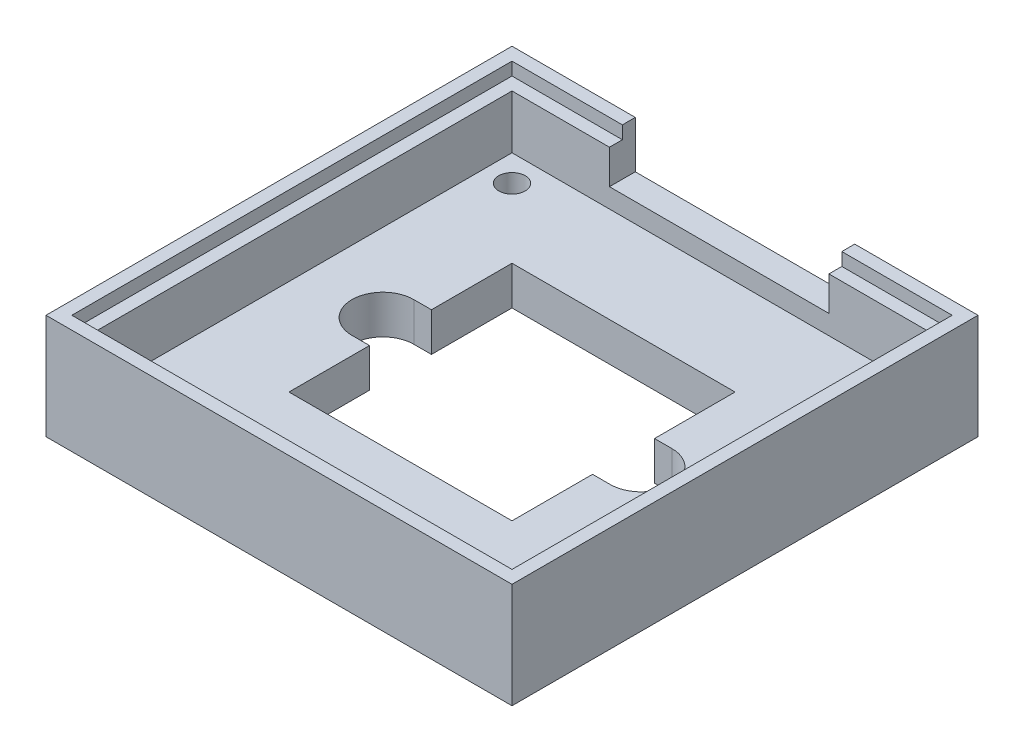
ISO-10303-21;
HEADER;
FILE_DESCRIPTION(('STEP AP214'),'2;1');
FILE_NAME('part.step','',(''),(''),'','','');
FILE_SCHEMA(('AUTOMOTIVE_DESIGN { 1 0 10303 214 1 1 1 1 }'));
ENDSEC;
DATA;
#1=APPLICATION_CONTEXT('core data for automotive mechanical design processes');
#2=APPLICATION_PROTOCOL_DEFINITION('international standard','automotive_design',2000,#1);
#3=PRODUCT_CONTEXT('',#1,'mechanical');
#4=PRODUCT('Part','Part','',(#3));
#5=PRODUCT_RELATED_PRODUCT_CATEGORY('part','',(#4));
#6=PRODUCT_DEFINITION_FORMATION('','',#4);
#7=PRODUCT_DEFINITION_CONTEXT('part definition',#1,'design');
#8=PRODUCT_DEFINITION('design','',#6,#7);
#9=PRODUCT_DEFINITION_SHAPE('','',#8);
#10=(LENGTH_UNIT() NAMED_UNIT(*) SI_UNIT(.MILLI.,.METRE.));
#11=(NAMED_UNIT(*) PLANE_ANGLE_UNIT() SI_UNIT($,.RADIAN.));
#12=(NAMED_UNIT(*) SI_UNIT($,.STERADIAN.) SOLID_ANGLE_UNIT());
#13=UNCERTAINTY_MEASURE_WITH_UNIT(LENGTH_MEASURE(1.E-05),#10,'distance_accuracy_value','');
#14=(GEOMETRIC_REPRESENTATION_CONTEXT(3) GLOBAL_UNCERTAINTY_ASSIGNED_CONTEXT((#13)) GLOBAL_UNIT_ASSIGNED_CONTEXT((#10,
#11,#12)) REPRESENTATION_CONTEXT('',''));
#15=CARTESIAN_POINT('',(0.,0.,0.));
#16=DIRECTION('',(0.,0.,1.));
#17=DIRECTION('',(1.,0.,0.));
#18=AXIS2_PLACEMENT_3D('',#15,#16,#17);
#19=CARTESIAN_POINT('',(-10.,3.,0.));
#20=DIRECTION('',(0.,-1.,0.));
#21=DIRECTION('',(0.,0.,-1.));
#22=AXIS2_PLACEMENT_3D('',#19,#20,#21);
#23=CYLINDRICAL_SURFACE('',#22,2.4);
#24=CARTESIAN_POINT('',(-10.,0.,0.));
#25=DIRECTION('',(0.,1.,0.));
#26=DIRECTION('',(0.,0.,1.));
#27=AXIS2_PLACEMENT_3D('',#24,#25,#26);
#28=CIRCLE('',#27,2.4);
#29=CARTESIAN_POINT('',(-10.,0.,-2.4));
#30=VERTEX_POINT('',#29);
#31=CARTESIAN_POINT('',(-10.,0.,2.4));
#32=VERTEX_POINT('',#31);
#33=EDGE_CURVE('E346',#30,#32,#28,.T.);
#34=ORIENTED_EDGE('',*,*,#33,.F.);
#35=DIRECTION('',(0.,-1.,0.));
#36=VECTOR('',#35,1.);
#37=CARTESIAN_POINT('',(-10.,3.,-2.4));
#38=LINE('',#37,#36);
#39=CARTESIAN_POINT('',(-10.,3.,-2.4));
#40=VERTEX_POINT('',#39);
#41=EDGE_CURVE('E419',#40,#30,#38,.T.);
#42=ORIENTED_EDGE('',*,*,#41,.F.);
#43=CARTESIAN_POINT('',(-10.,3.,0.));
#44=DIRECTION('',(0.,1.,0.));
#45=DIRECTION('',(0.,0.,1.));
#46=AXIS2_PLACEMENT_3D('',#43,#44,#45);
#47=CIRCLE('',#46,2.4);
#48=CARTESIAN_POINT('',(-10.,3.,2.4));
#49=VERTEX_POINT('',#48);
#50=EDGE_CURVE('E289',#40,#49,#47,.T.);
#51=ORIENTED_EDGE('',*,*,#50,.T.);
#52=DIRECTION('',(0.,-1.,0.));
#53=VECTOR('',#52,1.);
#54=CARTESIAN_POINT('',(-10.,3.,2.4));
#55=LINE('',#54,#53);
#56=EDGE_CURVE('E393',#49,#32,#55,.T.);
#57=ORIENTED_EDGE('',*,*,#56,.T.);
#58=EDGE_LOOP('',(#34,#42,#51,#57));
#59=FACE_BOUND('',#58,.T.);
#60=ADVANCED_FACE('F49',(#59),#23,.F.);
#61=CARTESIAN_POINT('',(0.,3.,-2.4));
#62=DIRECTION('',(0.,0.,-1.));
#63=DIRECTION('',(-1.,0.,0.));
#64=AXIS2_PLACEMENT_3D('',#61,#62,#63);
#65=PLANE('',#64);
#66=DIRECTION('',(1.,0.,0.));
#67=VECTOR('',#66,1.);
#68=CARTESIAN_POINT('',(0.,0.,-2.4));
#69=LINE('',#68,#67);
#70=CARTESIAN_POINT('',(-8.64,0.,-2.4));
#71=VERTEX_POINT('',#70);
#72=EDGE_CURVE('E349',#30,#71,#69,.T.);
#73=ORIENTED_EDGE('',*,*,#72,.T.);
#74=DIRECTION('',(0.,-1.,0.));
#75=VECTOR('',#74,1.);
#76=CARTESIAN_POINT('',(-8.64,3.,-2.4));
#77=LINE('',#76,#75);
#78=CARTESIAN_POINT('',(-8.64,3.,-2.4));
#79=VERTEX_POINT('',#78);
#80=EDGE_CURVE('E416',#79,#71,#77,.T.);
#81=ORIENTED_EDGE('',*,*,#80,.F.);
#82=DIRECTION('',(1.,0.,0.));
#83=VECTOR('',#82,1.);
#84=CARTESIAN_POINT('',(0.,3.,-2.4));
#85=LINE('',#84,#83);
#86=EDGE_CURVE('E292',#40,#79,#85,.T.);
#87=ORIENTED_EDGE('',*,*,#86,.F.);
#88=ORIENTED_EDGE('',*,*,#41,.T.);
#89=EDGE_LOOP('',(#73,#81,#87,#88));
#90=FACE_BOUND('',#89,.T.);
#91=ADVANCED_FACE('F576',(#90),#65,.F.);
#92=CARTESIAN_POINT('',(-8.64,3.,0.));
#93=DIRECTION('',(-1.,0.,0.));
#94=DIRECTION('',(0.,0.,1.));
#95=AXIS2_PLACEMENT_3D('',#92,#93,#94);
#96=PLANE('',#95);
#97=DIRECTION('',(0.,0.,-1.));
#98=VECTOR('',#97,1.);
#99=CARTESIAN_POINT('',(-8.64,0.,0.));
#100=LINE('',#99,#98);
#101=CARTESIAN_POINT('',(-8.64,0.,-8.64));
#102=VERTEX_POINT('',#101);
#103=EDGE_CURVE('E352',#71,#102,#100,.T.);
#104=ORIENTED_EDGE('',*,*,#103,.T.);
#105=DIRECTION('',(0.,-1.,0.));
#106=VECTOR('',#105,1.);
#107=CARTESIAN_POINT('',(-8.64,3.,-8.64));
#108=LINE('',#107,#106);
#109=CARTESIAN_POINT('',(-8.64,3.,-8.64));
#110=VERTEX_POINT('',#109);
#111=EDGE_CURVE('E413',#110,#102,#108,.T.);
#112=ORIENTED_EDGE('',*,*,#111,.F.);
#113=DIRECTION('',(0.,0.,-1.));
#114=VECTOR('',#113,1.);
#115=CARTESIAN_POINT('',(-8.64,3.,0.));
#116=LINE('',#115,#114);
#117=EDGE_CURVE('E296',#79,#110,#116,.T.);
#118=ORIENTED_EDGE('',*,*,#117,.F.);
#119=ORIENTED_EDGE('',*,*,#80,.T.);
#120=EDGE_LOOP('',(#104,#112,#118,#119));
#121=FACE_BOUND('',#120,.T.);
#122=ADVANCED_FACE('F582',(#121),#96,.F.);
#123=CARTESIAN_POINT('',(0.,3.,-8.64));
#124=DIRECTION('',(0.,0.,-1.));
#125=DIRECTION('',(-1.,0.,0.));
#126=AXIS2_PLACEMENT_3D('',#123,#124,#125);
#127=PLANE('',#126);
#128=DIRECTION('',(1.,0.,0.));
#129=VECTOR('',#128,1.);
#130=CARTESIAN_POINT('',(0.,0.,-8.64));
#131=LINE('',#130,#129);
#132=CARTESIAN_POINT('',(8.64,0.,-8.64));
#133=VERTEX_POINT('',#132);
#134=EDGE_CURVE('E355',#102,#133,#131,.T.);
#135=ORIENTED_EDGE('',*,*,#134,.T.);
#136=DIRECTION('',(0.,-1.,0.));
#137=VECTOR('',#136,1.);
#138=CARTESIAN_POINT('',(8.64,3.,-8.64));
#139=LINE('',#138,#137);
#140=CARTESIAN_POINT('',(8.64,3.,-8.64));
#141=VERTEX_POINT('',#140);
#142=EDGE_CURVE('E411',#141,#133,#139,.T.);
#143=ORIENTED_EDGE('',*,*,#142,.F.);
#144=DIRECTION('',(1.,0.,0.));
#145=VECTOR('',#144,1.);
#146=CARTESIAN_POINT('',(0.,3.,-8.64));
#147=LINE('',#146,#145);
#148=EDGE_CURVE('E299',#110,#141,#147,.T.);
#149=ORIENTED_EDGE('',*,*,#148,.F.);
#150=ORIENTED_EDGE('',*,*,#111,.T.);
#151=EDGE_LOOP('',(#135,#143,#149,#150));
#152=FACE_BOUND('',#151,.T.);
#153=ADVANCED_FACE('F631',(#152),#127,.F.);
#154=CARTESIAN_POINT('',(8.64,3.,0.));
#155=DIRECTION('',(-1.,0.,0.));
#156=DIRECTION('',(0.,0.,1.));
#157=AXIS2_PLACEMENT_3D('',#154,#155,#156);
#158=PLANE('',#157);
#159=DIRECTION('',(0.,0.,-1.));
#160=VECTOR('',#159,1.);
#161=CARTESIAN_POINT('',(8.64,0.,0.));
#162=LINE('',#161,#160);
#163=CARTESIAN_POINT('',(8.64,0.,-2.4));
#164=VERTEX_POINT('',#163);
#165=EDGE_CURVE('E358',#164,#133,#162,.T.);
#166=ORIENTED_EDGE('',*,*,#165,.F.);
#167=DIRECTION('',(0.,-1.,0.));
#168=VECTOR('',#167,1.);
#169=CARTESIAN_POINT('',(8.64,3.,-2.4));
#170=LINE('',#169,#168);
#171=CARTESIAN_POINT('',(8.64,3.,-2.4));
#172=VERTEX_POINT('',#171);
#173=EDGE_CURVE('E409',#172,#164,#170,.T.);
#174=ORIENTED_EDGE('',*,*,#173,.F.);
#175=DIRECTION('',(0.,0.,-1.));
#176=VECTOR('',#175,1.);
#177=CARTESIAN_POINT('',(8.64,3.,0.));
#178=LINE('',#177,#176);
#179=EDGE_CURVE('E301',#172,#141,#178,.T.);
#180=ORIENTED_EDGE('',*,*,#179,.T.);
#181=ORIENTED_EDGE('',*,*,#142,.T.);
#182=EDGE_LOOP('',(#166,#174,#180,#181));
#183=FACE_BOUND('',#182,.T.);
#184=ADVANCED_FACE('F627',(#183),#158,.T.);
#185=CARTESIAN_POINT('',(0.,3.,-2.4));
#186=DIRECTION('',(0.,0.,1.));
#187=DIRECTION('',(1.,0.,0.));
#188=AXIS2_PLACEMENT_3D('',#185,#186,#187);
#189=PLANE('',#188);
#190=DIRECTION('',(-1.,0.,0.));
#191=VECTOR('',#190,1.);
#192=CARTESIAN_POINT('',(0.,0.,-2.4));
#193=LINE('',#192,#191);
#194=CARTESIAN_POINT('',(10.,0.,-2.4));
#195=VERTEX_POINT('',#194);
#196=EDGE_CURVE('E361',#195,#164,#193,.T.);
#197=ORIENTED_EDGE('',*,*,#196,.F.);
#198=DIRECTION('',(0.,-1.,0.));
#199=VECTOR('',#198,1.);
#200=CARTESIAN_POINT('',(10.,3.,-2.4));
#201=LINE('',#200,#199);
#202=CARTESIAN_POINT('',(10.,3.,-2.4));
#203=VERTEX_POINT('',#202);
#204=EDGE_CURVE('E407',#203,#195,#201,.T.);
#205=ORIENTED_EDGE('',*,*,#204,.F.);
#206=DIRECTION('',(-1.,0.,0.));
#207=VECTOR('',#206,1.);
#208=CARTESIAN_POINT('',(0.,3.,-2.4));
#209=LINE('',#208,#207);
#210=EDGE_CURVE('E304',#203,#172,#209,.T.);
#211=ORIENTED_EDGE('',*,*,#210,.T.);
#212=ORIENTED_EDGE('',*,*,#173,.T.);
#213=EDGE_LOOP('',(#197,#205,#211,#212));
#214=FACE_BOUND('',#213,.T.);
#215=ADVANCED_FACE('F623',(#214),#189,.T.);
#216=CARTESIAN_POINT('',(10.,3.,0.));
#217=DIRECTION('',(0.,-1.,0.));
#218=DIRECTION('',(0.,0.,-1.));
#219=AXIS2_PLACEMENT_3D('',#216,#217,#218);
#220=CYLINDRICAL_SURFACE('',#219,2.4);
#221=CARTESIAN_POINT('',(10.,0.,0.));
#222=DIRECTION('',(0.,1.,0.));
#223=DIRECTION('',(0.,0.,1.));
#224=AXIS2_PLACEMENT_3D('',#221,#222,#223);
#225=CIRCLE('',#224,2.4);
#226=CARTESIAN_POINT('',(10.,0.,2.4));
#227=VERTEX_POINT('',#226);
#228=EDGE_CURVE('E364',#195,#227,#225,.F.);
#229=ORIENTED_EDGE('',*,*,#228,.T.);
#230=DIRECTION('',(0.,-1.,0.));
#231=VECTOR('',#230,1.);
#232=CARTESIAN_POINT('',(10.,3.,2.4));
#233=LINE('',#232,#231);
#234=CARTESIAN_POINT('',(10.,3.,2.4));
#235=VERTEX_POINT('',#234);
#236=EDGE_CURVE('E404',#235,#227,#233,.T.);
#237=ORIENTED_EDGE('',*,*,#236,.F.);
#238=CARTESIAN_POINT('',(10.,3.,0.));
#239=DIRECTION('',(0.,1.,0.));
#240=DIRECTION('',(0.,0.,1.));
#241=AXIS2_PLACEMENT_3D('',#238,#239,#240);
#242=CIRCLE('',#241,2.4);
#243=EDGE_CURVE('E307',#203,#235,#242,.F.);
#244=ORIENTED_EDGE('',*,*,#243,.F.);
#245=ORIENTED_EDGE('',*,*,#204,.T.);
#246=EDGE_LOOP('',(#229,#237,#244,#245));
#247=FACE_BOUND('',#246,.T.);
#248=ADVANCED_FACE('F619',(#247),#220,.F.);
#249=CARTESIAN_POINT('',(0.,3.,2.4));
#250=DIRECTION('',(0.,0.,1.));
#251=DIRECTION('',(1.,0.,0.));
#252=AXIS2_PLACEMENT_3D('',#249,#250,#251);
#253=PLANE('',#252);
#254=DIRECTION('',(-1.,0.,0.));
#255=VECTOR('',#254,1.);
#256=CARTESIAN_POINT('',(0.,0.,2.4));
#257=LINE('',#256,#255);
#258=CARTESIAN_POINT('',(8.64,0.,2.4));
#259=VERTEX_POINT('',#258);
#260=EDGE_CURVE('E367',#227,#259,#257,.T.);
#261=ORIENTED_EDGE('',*,*,#260,.T.);
#262=DIRECTION('',(0.,-1.,0.));
#263=VECTOR('',#262,1.);
#264=CARTESIAN_POINT('',(8.64,3.,2.4));
#265=LINE('',#264,#263);
#266=CARTESIAN_POINT('',(8.64,3.,2.4));
#267=VERTEX_POINT('',#266);
#268=EDGE_CURVE('E402',#267,#259,#265,.T.);
#269=ORIENTED_EDGE('',*,*,#268,.F.);
#270=DIRECTION('',(-1.,0.,0.));
#271=VECTOR('',#270,1.);
#272=CARTESIAN_POINT('',(0.,3.,2.4));
#273=LINE('',#272,#271);
#274=EDGE_CURVE('E310',#235,#267,#273,.T.);
#275=ORIENTED_EDGE('',*,*,#274,.F.);
#276=ORIENTED_EDGE('',*,*,#236,.T.);
#277=EDGE_LOOP('',(#261,#269,#275,#276));
#278=FACE_BOUND('',#277,.T.);
#279=ADVANCED_FACE('F615',(#278),#253,.F.);
#280=CARTESIAN_POINT('',(8.64,3.,0.));
#281=DIRECTION('',(-1.,0.,0.));
#282=DIRECTION('',(0.,0.,1.));
#283=AXIS2_PLACEMENT_3D('',#280,#281,#282);
#284=PLANE('',#283);
#285=DIRECTION('',(0.,0.,-1.));
#286=VECTOR('',#285,1.);
#287=CARTESIAN_POINT('',(8.64,0.,0.));
#288=LINE('',#287,#286);
#289=CARTESIAN_POINT('',(8.64,0.,8.64));
#290=VERTEX_POINT('',#289);
#291=EDGE_CURVE('E370',#290,#259,#288,.T.);
#292=ORIENTED_EDGE('',*,*,#291,.F.);
#293=DIRECTION('',(0.,-1.,0.));
#294=VECTOR('',#293,1.);
#295=CARTESIAN_POINT('',(8.64,3.,8.64));
#296=LINE('',#295,#294);
#297=CARTESIAN_POINT('',(8.64,3.,8.64));
#298=VERTEX_POINT('',#297);
#299=EDGE_CURVE('E400',#298,#290,#296,.T.);
#300=ORIENTED_EDGE('',*,*,#299,.F.);
#301=DIRECTION('',(0.,0.,-1.));
#302=VECTOR('',#301,1.);
#303=CARTESIAN_POINT('',(8.64,3.,0.));
#304=LINE('',#303,#302);
#305=EDGE_CURVE('E312',#298,#267,#304,.T.);
#306=ORIENTED_EDGE('',*,*,#305,.T.);
#307=ORIENTED_EDGE('',*,*,#268,.T.);
#308=EDGE_LOOP('',(#292,#300,#306,#307));
#309=FACE_BOUND('',#308,.T.);
#310=ADVANCED_FACE('F607',(#309),#284,.T.);
#311=CARTESIAN_POINT('',(0.,3.,8.64));
#312=DIRECTION('',(0.,0.,-1.));
#313=DIRECTION('',(-1.,0.,0.));
#314=AXIS2_PLACEMENT_3D('',#311,#312,#313);
#315=PLANE('',#314);
#316=DIRECTION('',(1.,0.,0.));
#317=VECTOR('',#316,1.);
#318=CARTESIAN_POINT('',(0.,0.,8.64));
#319=LINE('',#318,#317);
#320=CARTESIAN_POINT('',(-8.64,0.,8.64));
#321=VERTEX_POINT('',#320);
#322=EDGE_CURVE('E373',#321,#290,#319,.T.);
#323=ORIENTED_EDGE('',*,*,#322,.F.);
#324=DIRECTION('',(0.,-1.,0.));
#325=VECTOR('',#324,1.);
#326=CARTESIAN_POINT('',(-8.64,3.,8.64));
#327=LINE('',#326,#325);
#328=CARTESIAN_POINT('',(-8.64,3.,8.64));
#329=VERTEX_POINT('',#328);
#330=EDGE_CURVE('E398',#329,#321,#327,.T.);
#331=ORIENTED_EDGE('',*,*,#330,.F.);
#332=DIRECTION('',(1.,0.,0.));
#333=VECTOR('',#332,1.);
#334=CARTESIAN_POINT('',(0.,3.,8.64));
#335=LINE('',#334,#333);
#336=EDGE_CURVE('E315',#329,#298,#335,.T.);
#337=ORIENTED_EDGE('',*,*,#336,.T.);
#338=ORIENTED_EDGE('',*,*,#299,.T.);
#339=EDGE_LOOP('',(#323,#331,#337,#338));
#340=FACE_BOUND('',#339,.T.);
#341=ADVANCED_FACE('F601',(#340),#315,.T.);
#342=CARTESIAN_POINT('',(-8.64,3.,0.));
#343=DIRECTION('',(-1.,0.,0.));
#344=DIRECTION('',(0.,0.,1.));
#345=AXIS2_PLACEMENT_3D('',#342,#343,#344);
#346=PLANE('',#345);
#347=DIRECTION('',(0.,0.,-1.));
#348=VECTOR('',#347,1.);
#349=CARTESIAN_POINT('',(-8.64,0.,0.));
#350=LINE('',#349,#348);
#351=CARTESIAN_POINT('',(-8.64,0.,2.4));
#352=VERTEX_POINT('',#351);
#353=EDGE_CURVE('E376',#321,#352,#350,.T.);
#354=ORIENTED_EDGE('',*,*,#353,.T.);
#355=DIRECTION('',(0.,-1.,0.));
#356=VECTOR('',#355,1.);
#357=CARTESIAN_POINT('',(-8.64,3.,2.4));
#358=LINE('',#357,#356);
#359=CARTESIAN_POINT('',(-8.64,3.,2.4));
#360=VERTEX_POINT('',#359);
#361=EDGE_CURVE('E395',#360,#352,#358,.T.);
#362=ORIENTED_EDGE('',*,*,#361,.F.);
#363=DIRECTION('',(0.,0.,-1.));
#364=VECTOR('',#363,1.);
#365=CARTESIAN_POINT('',(-8.64,3.,0.));
#366=LINE('',#365,#364);
#367=EDGE_CURVE('E318',#329,#360,#366,.T.);
#368=ORIENTED_EDGE('',*,*,#367,.F.);
#369=ORIENTED_EDGE('',*,*,#330,.T.);
#370=EDGE_LOOP('',(#354,#362,#368,#369));
#371=FACE_BOUND('',#370,.T.);
#372=ADVANCED_FACE('F597',(#371),#346,.F.);
#373=CARTESIAN_POINT('',(-18.05,3.,0.));
#374=DIRECTION('',(-1.,0.,0.));
#375=DIRECTION('',(0.,0.,1.));
#376=AXIS2_PLACEMENT_3D('',#373,#374,#375);
#377=PLANE('',#376);
#378=DIRECTION('',(0.,0.,-1.));
#379=VECTOR('',#378,1.);
#380=CARTESIAN_POINT('',(-18.05,0.,0.));
#381=LINE('',#380,#379);
#382=CARTESIAN_POINT('',(-18.05,0.,18.05));
#383=VERTEX_POINT('',#382);
#384=CARTESIAN_POINT('',(-18.05,0.,-18.05));
#385=VERTEX_POINT('',#384);
#386=EDGE_CURVE('E288',#383,#385,#381,.T.);
#387=ORIENTED_EDGE('',*,*,#386,.F.);
#388=DIRECTION('',(0.,-1.,0.));
#389=VECTOR('',#388,1.);
#390=CARTESIAN_POINT('',(-18.05,3.,18.05));
#391=LINE('',#390,#389);
#392=CARTESIAN_POINT('',(-18.05,8.15,18.05));
#393=VERTEX_POINT('',#392);
#394=EDGE_CURVE('E396',#393,#383,#391,.T.);
#395=ORIENTED_EDGE('',*,*,#394,.F.);
#396=DIRECTION('',(0.,0.,-1.));
#397=VECTOR('',#396,1.);
#398=CARTESIAN_POINT('',(-18.05,8.15,0.));
#399=LINE('',#398,#397);
#400=CARTESIAN_POINT('',(-18.05,8.15,-18.05));
#401=VERTEX_POINT('',#400);
#402=EDGE_CURVE('E460',#393,#401,#399,.T.);
#403=ORIENTED_EDGE('',*,*,#402,.T.);
#404=DIRECTION('',(0.,-1.,0.));
#405=VECTOR('',#404,1.);
#406=CARTESIAN_POINT('',(-18.05,3.,-18.05));
#407=LINE('',#406,#405);
#408=EDGE_CURVE('E335',#401,#385,#407,.T.);
#409=ORIENTED_EDGE('',*,*,#408,.T.);
#410=EDGE_LOOP('',(#387,#395,#403,#409));
#411=FACE_BOUND('',#410,.T.);
#412=ADVANCED_FACE('F51',(#411),#377,.T.);
#413=CARTESIAN_POINT('',(0.,3.,18.05));
#414=DIRECTION('',(0.,0.,-1.));
#415=DIRECTION('',(-1.,0.,0.));
#416=AXIS2_PLACEMENT_3D('',#413,#414,#415);
#417=PLANE('',#416);
#418=DIRECTION('',(1.,0.,0.));
#419=VECTOR('',#418,1.);
#420=CARTESIAN_POINT('',(0.,0.,18.05));
#421=LINE('',#420,#419);
#422=CARTESIAN_POINT('',(18.05,0.,18.05));
#423=VERTEX_POINT('',#422);
#424=EDGE_CURVE('E338',#383,#423,#421,.T.);
#425=ORIENTED_EDGE('',*,*,#424,.T.);
#426=DIRECTION('',(0.,-1.,0.));
#427=VECTOR('',#426,1.);
#428=CARTESIAN_POINT('',(18.05,3.,18.05));
#429=LINE('',#428,#427);
#430=CARTESIAN_POINT('',(18.05,8.15,18.05));
#431=VERTEX_POINT('',#430);
#432=EDGE_CURVE('E425',#431,#423,#429,.T.);
#433=ORIENTED_EDGE('',*,*,#432,.F.);
#434=DIRECTION('',(1.,0.,0.));
#435=VECTOR('',#434,1.);
#436=CARTESIAN_POINT('',(0.,8.15,18.05));
#437=LINE('',#436,#435);
#438=EDGE_CURVE('E456',#393,#431,#437,.T.);
#439=ORIENTED_EDGE('',*,*,#438,.F.);
#440=ORIENTED_EDGE('',*,*,#394,.T.);
#441=EDGE_LOOP('',(#425,#433,#439,#440));
#442=FACE_BOUND('',#441,.T.);
#443=ADVANCED_FACE('F552',(#442),#417,.F.);
#444=CARTESIAN_POINT('',(18.05,3.,0.));
#445=DIRECTION('',(-1.,0.,0.));
#446=DIRECTION('',(0.,0.,1.));
#447=AXIS2_PLACEMENT_3D('',#444,#445,#446);
#448=PLANE('',#447);
#449=DIRECTION('',(0.,0.,-1.));
#450=VECTOR('',#449,1.);
#451=CARTESIAN_POINT('',(18.05,0.,0.));
#452=LINE('',#451,#450);
#453=CARTESIAN_POINT('',(18.05,0.,-18.05));
#454=VERTEX_POINT('',#453);
#455=EDGE_CURVE('E340',#423,#454,#452,.T.);
#456=ORIENTED_EDGE('',*,*,#455,.T.);
#457=DIRECTION('',(0.,-1.,0.));
#458=VECTOR('',#457,1.);
#459=CARTESIAN_POINT('',(18.05,3.,-18.05));
#460=LINE('',#459,#458);
#461=CARTESIAN_POINT('',(18.05,8.15,-18.05));
#462=VERTEX_POINT('',#461);
#463=EDGE_CURVE('E423',#462,#454,#460,.T.);
#464=ORIENTED_EDGE('',*,*,#463,.F.);
#465=DIRECTION('',(0.,0.,-1.));
#466=VECTOR('',#465,1.);
#467=CARTESIAN_POINT('',(18.05,8.15,0.));
#468=LINE('',#467,#466);
#469=EDGE_CURVE('E454',#431,#462,#468,.T.);
#470=ORIENTED_EDGE('',*,*,#469,.F.);
#471=ORIENTED_EDGE('',*,*,#432,.T.);
#472=EDGE_LOOP('',(#456,#464,#470,#471));
#473=FACE_BOUND('',#472,.T.);
#474=ADVANCED_FACE('F555',(#473),#448,.F.);
#475=CARTESIAN_POINT('',(14.,3.,14.));
#476=DIRECTION('',(0.,-1.,0.));
#477=DIRECTION('',(0.,0.,-1.));
#478=AXIS2_PLACEMENT_3D('',#475,#476,#477);
#479=CYLINDRICAL_SURFACE('',#478,1.02499999986442);
#480=CARTESIAN_POINT('',(14.,3.,14.));
#481=DIRECTION('',(0.,1.,0.));
#482=DIRECTION('',(0.,0.,1.));
#483=AXIS2_PLACEMENT_3D('',#480,#481,#482);
#484=CIRCLE('',#483,1.02499999986442);
#485=CARTESIAN_POINT('',(14.,3.,15.0249999998644));
#486=VERTEX_POINT('',#485);
#487=EDGE_CURVE('E329',#486,#486,#484,.T.);
#488=ORIENTED_EDGE('',*,*,#487,.T.);
#489=EDGE_LOOP('',(#488));
#490=FACE_BOUND('',#489,.T.);
#491=CARTESIAN_POINT('',(14.,0.,14.));
#492=DIRECTION('',(0.,1.,0.));
#493=DIRECTION('',(0.,0.,1.));
#494=AXIS2_PLACEMENT_3D('',#491,#492,#493);
#495=CIRCLE('',#494,1.02499999986442);
#496=CARTESIAN_POINT('',(14.,0.,15.0249999998644));
#497=VERTEX_POINT('',#496);
#498=EDGE_CURVE('E388',#497,#497,#495,.T.);
#499=ORIENTED_EDGE('',*,*,#498,.F.);
#500=EDGE_LOOP('',(#499));
#501=FACE_BOUND('',#500,.T.);
#502=ADVANCED_FACE('F592',(#490,#501),#479,.F.);
#503=CARTESIAN_POINT('',(14.,3.,-14.));
#504=DIRECTION('',(0.,-1.,0.));
#505=DIRECTION('',(0.,0.,-1.));
#506=AXIS2_PLACEMENT_3D('',#503,#504,#505);
#507=CYLINDRICAL_SURFACE('',#506,1.02499999986442);
#508=CARTESIAN_POINT('',(14.,3.,-14.));
#509=DIRECTION('',(0.,1.,0.));
#510=DIRECTION('',(0.,0.,1.));
#511=AXIS2_PLACEMENT_3D('',#508,#509,#510);
#512=CIRCLE('',#511,1.02499999986442);
#513=CARTESIAN_POINT('',(14.,3.,-12.9750000001356));
#514=VERTEX_POINT('',#513);
#515=EDGE_CURVE('E326',#514,#514,#512,.T.);
#516=ORIENTED_EDGE('',*,*,#515,.T.);
#517=EDGE_LOOP('',(#516));
#518=FACE_BOUND('',#517,.T.);
#519=CARTESIAN_POINT('',(14.,0.,-14.));
#520=DIRECTION('',(0.,1.,0.));
#521=DIRECTION('',(0.,0.,1.));
#522=AXIS2_PLACEMENT_3D('',#519,#520,#521);
#523=CIRCLE('',#522,1.02499999986442);
#524=CARTESIAN_POINT('',(14.,0.,-12.9750000001356));
#525=VERTEX_POINT('',#524);
#526=EDGE_CURVE('E385',#525,#525,#523,.T.);
#527=ORIENTED_EDGE('',*,*,#526,.F.);
#528=EDGE_LOOP('',(#527));
#529=FACE_BOUND('',#528,.T.);
#530=ADVANCED_FACE('F670',(#518,#529),#507,.F.);
#531=CARTESIAN_POINT('',(-14.,3.,-14.));
#532=DIRECTION('',(0.,-1.,0.));
#533=DIRECTION('',(0.,0.,-1.));
#534=AXIS2_PLACEMENT_3D('',#531,#532,#533);
#535=CYLINDRICAL_SURFACE('',#534,1.02499999986442);
#536=CARTESIAN_POINT('',(-14.,3.,-14.));
#537=DIRECTION('',(0.,1.,0.));
#538=DIRECTION('',(0.,0.,1.));
#539=AXIS2_PLACEMENT_3D('',#536,#537,#538);
#540=CIRCLE('',#539,1.02499999986442);
#541=CARTESIAN_POINT('',(-14.,3.,-12.9750000001356));
#542=VERTEX_POINT('',#541);
#543=EDGE_CURVE('E323',#542,#542,#540,.T.);
#544=ORIENTED_EDGE('',*,*,#543,.T.);
#545=EDGE_LOOP('',(#544));
#546=FACE_BOUND('',#545,.T.);
#547=CARTESIAN_POINT('',(-14.,0.,-14.));
#548=DIRECTION('',(0.,1.,0.));
#549=DIRECTION('',(0.,0.,1.));
#550=AXIS2_PLACEMENT_3D('',#547,#548,#549);
#551=CIRCLE('',#550,1.02499999986442);
#552=CARTESIAN_POINT('',(-14.,0.,-12.9750000001356));
#553=VERTEX_POINT('',#552);
#554=EDGE_CURVE('E382',#553,#553,#551,.T.);
#555=ORIENTED_EDGE('',*,*,#554,.F.);
#556=EDGE_LOOP('',(#555));
#557=FACE_BOUND('',#556,.T.);
#558=ADVANCED_FACE('F666',(#546,#557),#535,.F.);
#559=CARTESIAN_POINT('',(0.,3.,2.4));
#560=DIRECTION('',(0.,0.,-1.));
#561=DIRECTION('',(-1.,0.,0.));
#562=AXIS2_PLACEMENT_3D('',#559,#560,#561);
#563=PLANE('',#562);
#564=DIRECTION('',(1.,0.,0.));
#565=VECTOR('',#564,1.);
#566=CARTESIAN_POINT('',(0.,0.,2.4));
#567=LINE('',#566,#565);
#568=EDGE_CURVE('E379',#32,#352,#567,.T.);
#569=ORIENTED_EDGE('',*,*,#568,.F.);
#570=ORIENTED_EDGE('',*,*,#56,.F.);
#571=DIRECTION('',(1.,0.,0.));
#572=VECTOR('',#571,1.);
#573=CARTESIAN_POINT('',(0.,3.,2.4));
#574=LINE('',#573,#572);
#575=EDGE_CURVE('E320',#49,#360,#574,.T.);
#576=ORIENTED_EDGE('',*,*,#575,.T.);
#577=ORIENTED_EDGE('',*,*,#361,.T.);
#578=EDGE_LOOP('',(#569,#570,#576,#577));
#579=FACE_BOUND('',#578,.T.);
#580=ADVANCED_FACE('F590',(#579),#563,.T.);
#581=CARTESIAN_POINT('',(0.,3.,-18.05));
#582=DIRECTION('',(0.,0.,-1.));
#583=DIRECTION('',(-1.,0.,0.));
#584=AXIS2_PLACEMENT_3D('',#581,#582,#583);
#585=PLANE('',#584);
#586=DIRECTION('',(0.,-1.,0.));
#587=VECTOR('',#586,1.);
#588=CARTESIAN_POINT('',(8.5,8.15,-18.05));
#589=LINE('',#588,#587);
#590=CARTESIAN_POINT('',(8.5,8.15,-18.05));
#591=VERTEX_POINT('',#590);
#592=CARTESIAN_POINT('',(8.5,4.5,-18.05));
#593=VERTEX_POINT('',#592);
#594=EDGE_CURVE('E437',#591,#593,#589,.T.);
#595=ORIENTED_EDGE('',*,*,#594,.F.);
#596=DIRECTION('',(1.,0.,0.));
#597=VECTOR('',#596,1.);
#598=CARTESIAN_POINT('',(0.,8.15,-18.05));
#599=LINE('',#598,#597);
#600=EDGE_CURVE('E445',#591,#462,#599,.T.);
#601=ORIENTED_EDGE('',*,*,#600,.T.);
#602=ORIENTED_EDGE('',*,*,#463,.T.);
#603=DIRECTION('',(1.,0.,0.));
#604=VECTOR('',#603,1.);
#605=CARTESIAN_POINT('',(0.,0.,-18.05));
#606=LINE('',#605,#604);
#607=EDGE_CURVE('E343',#385,#454,#606,.T.);
#608=ORIENTED_EDGE('',*,*,#607,.F.);
#609=ORIENTED_EDGE('',*,*,#408,.F.);
#610=CARTESIAN_POINT('',(-8.5,8.15,-18.05));
#611=VERTEX_POINT('',#610);
#612=EDGE_CURVE('E274',#401,#611,#599,.T.);
#613=ORIENTED_EDGE('',*,*,#612,.T.);
#614=DIRECTION('',(0.,1.,0.));
#615=VECTOR('',#614,1.);
#616=CARTESIAN_POINT('',(-8.5,8.15,-18.05));
#617=LINE('',#616,#615);
#618=CARTESIAN_POINT('',(-8.5,4.5,-18.05));
#619=VERTEX_POINT('',#618);
#620=EDGE_CURVE('E72',#619,#611,#617,.T.);
#621=ORIENTED_EDGE('',*,*,#620,.F.);
#622=DIRECTION('',(-1.,0.,0.));
#623=VECTOR('',#622,1.);
#624=CARTESIAN_POINT('',(8.5,4.5,-18.05));
#625=LINE('',#624,#623);
#626=EDGE_CURVE('E448',#593,#619,#625,.T.);
#627=ORIENTED_EDGE('',*,*,#626,.F.);
#628=EDGE_LOOP('',(#595,#601,#602,#608,#609,#613,#621,#627));
#629=FACE_BOUND('',#628,.T.);
#630=ADVANCED_FACE('F444',(#629),#585,.T.);
#631=CARTESIAN_POINT('',(-14.,3.,14.));
#632=DIRECTION('',(0.,-1.,0.));
#633=DIRECTION('',(0.,0.,-1.));
#634=AXIS2_PLACEMENT_3D('',#631,#632,#633);
#635=CYLINDRICAL_SURFACE('',#634,1.02499999986442);
#636=CARTESIAN_POINT('',(-14.,3.,14.));
#637=DIRECTION('',(0.,1.,0.));
#638=DIRECTION('',(0.,0.,1.));
#639=AXIS2_PLACEMENT_3D('',#636,#637,#638);
#640=CIRCLE('',#639,1.02499999986442);
#641=CARTESIAN_POINT('',(-14.,3.,15.0249999998644));
#642=VERTEX_POINT('',#641);
#643=EDGE_CURVE('E332',#642,#642,#640,.T.);
#644=ORIENTED_EDGE('',*,*,#643,.T.);
#645=EDGE_LOOP('',(#644));
#646=FACE_BOUND('',#645,.T.);
#647=CARTESIAN_POINT('',(-14.,0.,14.));
#648=DIRECTION('',(0.,1.,0.));
#649=DIRECTION('',(0.,0.,1.));
#650=AXIS2_PLACEMENT_3D('',#647,#648,#649);
#651=CIRCLE('',#650,1.02499999986442);
#652=CARTESIAN_POINT('',(-14.,0.,15.0249999998644));
#653=VERTEX_POINT('',#652);
#654=EDGE_CURVE('E293',#653,#653,#651,.T.);
#655=ORIENTED_EDGE('',*,*,#654,.F.);
#656=EDGE_LOOP('',(#655));
#657=FACE_BOUND('',#656,.T.);
#658=ADVANCED_FACE('F570',(#646,#657),#635,.F.);
#659=CARTESIAN_POINT('',(0.,3.,0.));
#660=DIRECTION('',(0.,1.,0.));
#661=DIRECTION('',(0.,0.,1.));
#662=AXIS2_PLACEMENT_3D('',#659,#660,#661);
#663=PLANE('',#662);
#664=DIRECTION('',(0.,0.,1.));
#665=VECTOR('',#664,1.);
#666=CARTESIAN_POINT('',(16.05,3.,0.));
#667=LINE('',#666,#665);
#668=CARTESIAN_POINT('',(16.05,3.,-16.05));
#669=VERTEX_POINT('',#668);
#670=CARTESIAN_POINT('',(16.05,3.,16.05));
#671=VERTEX_POINT('',#670);
#672=EDGE_CURVE('E285',#669,#671,#667,.T.);
#673=ORIENTED_EDGE('',*,*,#672,.F.);
#674=DIRECTION('',(-1.,0.,0.));
#675=VECTOR('',#674,1.);
#676=CARTESIAN_POINT('',(0.,3.,-16.05));
#677=LINE('',#676,#675);
#678=CARTESIAN_POINT('',(-16.05,3.,-16.05));
#679=VERTEX_POINT('',#678);
#680=EDGE_CURVE('E279',#669,#679,#677,.T.);
#681=ORIENTED_EDGE('',*,*,#680,.T.);
#682=DIRECTION('',(0.,0.,1.));
#683=VECTOR('',#682,1.);
#684=CARTESIAN_POINT('',(-16.05,3.,0.));
#685=LINE('',#684,#683);
#686=CARTESIAN_POINT('',(-16.05,3.,16.05));
#687=VERTEX_POINT('',#686);
#688=EDGE_CURVE('E267',#679,#687,#685,.T.);
#689=ORIENTED_EDGE('',*,*,#688,.T.);
#690=DIRECTION('',(-1.,0.,0.));
#691=VECTOR('',#690,1.);
#692=CARTESIAN_POINT('',(0.,3.,16.05));
#693=LINE('',#692,#691);
#694=EDGE_CURVE('E282',#671,#687,#693,.T.);
#695=ORIENTED_EDGE('',*,*,#694,.F.);
#696=EDGE_LOOP('',(#673,#681,#689,#695));
#697=FACE_BOUND('',#696,.T.);
#698=ORIENTED_EDGE('',*,*,#50,.F.);
#699=ORIENTED_EDGE('',*,*,#86,.T.);
#700=ORIENTED_EDGE('',*,*,#117,.T.);
#701=ORIENTED_EDGE('',*,*,#148,.T.);
#702=ORIENTED_EDGE('',*,*,#179,.F.);
#703=ORIENTED_EDGE('',*,*,#210,.F.);
#704=ORIENTED_EDGE('',*,*,#243,.T.);
#705=ORIENTED_EDGE('',*,*,#274,.T.);
#706=ORIENTED_EDGE('',*,*,#305,.F.);
#707=ORIENTED_EDGE('',*,*,#336,.F.);
#708=ORIENTED_EDGE('',*,*,#367,.T.);
#709=ORIENTED_EDGE('',*,*,#575,.F.);
#710=EDGE_LOOP('',(#698,#699,#700,#701,#702,#703,#704,#705,#706,#707,#708,#709));
#711=FACE_BOUND('',#710,.T.);
#712=ORIENTED_EDGE('',*,*,#543,.F.);
#713=EDGE_LOOP('',(#712));
#714=FACE_BOUND('',#713,.T.);
#715=ORIENTED_EDGE('',*,*,#515,.F.);
#716=EDGE_LOOP('',(#715));
#717=FACE_BOUND('',#716,.T.);
#718=ORIENTED_EDGE('',*,*,#487,.F.);
#719=EDGE_LOOP('',(#718));
#720=FACE_BOUND('',#719,.T.);
#721=ORIENTED_EDGE('',*,*,#643,.F.);
#722=EDGE_LOOP('',(#721));
#723=FACE_BOUND('',#722,.T.);
#724=ADVANCED_FACE('F560',(#697,#711,#714,#717,#720,#723),#663,.T.);
#725=CARTESIAN_POINT('',(0.,0.,0.));
#726=DIRECTION('',(0.,1.,0.));
#727=DIRECTION('',(0.,0.,1.));
#728=AXIS2_PLACEMENT_3D('',#725,#726,#727);
#729=PLANE('',#728);
#730=ORIENTED_EDGE('',*,*,#33,.T.);
#731=ORIENTED_EDGE('',*,*,#568,.T.);
#732=ORIENTED_EDGE('',*,*,#353,.F.);
#733=ORIENTED_EDGE('',*,*,#322,.T.);
#734=ORIENTED_EDGE('',*,*,#291,.T.);
#735=ORIENTED_EDGE('',*,*,#260,.F.);
#736=ORIENTED_EDGE('',*,*,#228,.F.);
#737=ORIENTED_EDGE('',*,*,#196,.T.);
#738=ORIENTED_EDGE('',*,*,#165,.T.);
#739=ORIENTED_EDGE('',*,*,#134,.F.);
#740=ORIENTED_EDGE('',*,*,#103,.F.);
#741=ORIENTED_EDGE('',*,*,#72,.F.);
#742=EDGE_LOOP('',(#730,#731,#732,#733,#734,#735,#736,#737,#738,#739,#740,#741));
#743=FACE_BOUND('',#742,.T.);
#744=ORIENTED_EDGE('',*,*,#554,.T.);
#745=EDGE_LOOP('',(#744));
#746=FACE_BOUND('',#745,.T.);
#747=ORIENTED_EDGE('',*,*,#526,.T.);
#748=EDGE_LOOP('',(#747));
#749=FACE_BOUND('',#748,.T.);
#750=ORIENTED_EDGE('',*,*,#498,.T.);
#751=EDGE_LOOP('',(#750));
#752=FACE_BOUND('',#751,.T.);
#753=ORIENTED_EDGE('',*,*,#654,.T.);
#754=EDGE_LOOP('',(#753));
#755=FACE_BOUND('',#754,.T.);
#756=ORIENTED_EDGE('',*,*,#386,.T.);
#757=ORIENTED_EDGE('',*,*,#607,.T.);
#758=ORIENTED_EDGE('',*,*,#455,.F.);
#759=ORIENTED_EDGE('',*,*,#424,.F.);
#760=EDGE_LOOP('',(#756,#757,#758,#759));
#761=FACE_BOUND('',#760,.T.);
#762=ADVANCED_FACE('F557',(#743,#746,#749,#752,#755,#761),#729,.F.);
#763=CARTESIAN_POINT('',(16.05,8.15,0.));
#764=DIRECTION('',(-1.,0.,0.));
#765=DIRECTION('',(0.,0.,1.));
#766=AXIS2_PLACEMENT_3D('',#763,#764,#765);
#767=PLANE('',#766);
#768=DIRECTION('',(0.,0.,1.));
#769=VECTOR('',#768,1.);
#770=CARTESIAN_POINT('',(16.05,7.15,16.05));
#771=LINE('',#770,#769);
#772=CARTESIAN_POINT('',(16.05,7.15,-16.05));
#773=VERTEX_POINT('',#772);
#774=CARTESIAN_POINT('',(16.05,7.15,16.05));
#775=VERTEX_POINT('',#774);
#776=EDGE_CURVE('E497',#773,#775,#771,.T.);
#777=ORIENTED_EDGE('',*,*,#776,.F.);
#778=DIRECTION('',(0.,-1.,0.));
#779=VECTOR('',#778,1.);
#780=CARTESIAN_POINT('',(16.05,8.15,-16.05));
#781=LINE('',#780,#779);
#782=EDGE_CURVE('E270',#773,#669,#781,.T.);
#783=ORIENTED_EDGE('',*,*,#782,.T.);
#784=ORIENTED_EDGE('',*,*,#672,.T.);
#785=DIRECTION('',(0.,-1.,0.));
#786=VECTOR('',#785,1.);
#787=CARTESIAN_POINT('',(16.05,8.15,16.05));
#788=LINE('',#787,#786);
#789=EDGE_CURVE('E272',#775,#671,#788,.T.);
#790=ORIENTED_EDGE('',*,*,#789,.F.);
#791=EDGE_LOOP('',(#777,#783,#784,#790));
#792=FACE_BOUND('',#791,.T.);
#793=ADVANCED_FACE('F559',(#792),#767,.T.);
#794=CARTESIAN_POINT('',(0.,8.15,16.05));
#795=DIRECTION('',(0.,0.,-1.));
#796=DIRECTION('',(-1.,0.,0.));
#797=AXIS2_PLACEMENT_3D('',#794,#795,#796);
#798=PLANE('',#797);
#799=DIRECTION('',(-1.,0.,0.));
#800=VECTOR('',#799,1.);
#801=CARTESIAN_POINT('',(-16.05,7.15,16.05));
#802=LINE('',#801,#800);
#803=CARTESIAN_POINT('',(-16.05,7.15,16.05));
#804=VERTEX_POINT('',#803);
#805=EDGE_CURVE('E249',#775,#804,#802,.T.);
#806=ORIENTED_EDGE('',*,*,#805,.F.);
#807=ORIENTED_EDGE('',*,*,#789,.T.);
#808=ORIENTED_EDGE('',*,*,#694,.T.);
#809=DIRECTION('',(0.,-1.,0.));
#810=VECTOR('',#809,1.);
#811=CARTESIAN_POINT('',(-16.05,8.15,16.05));
#812=LINE('',#811,#810);
#813=EDGE_CURVE('E269',#804,#687,#812,.T.);
#814=ORIENTED_EDGE('',*,*,#813,.F.);
#815=EDGE_LOOP('',(#806,#807,#808,#814));
#816=FACE_BOUND('',#815,.T.);
#817=ADVANCED_FACE('F567',(#816),#798,.T.);
#818=CARTESIAN_POINT('',(-16.05,8.15,0.));
#819=DIRECTION('',(-1.,0.,0.));
#820=DIRECTION('',(0.,0.,1.));
#821=AXIS2_PLACEMENT_3D('',#818,#819,#820);
#822=PLANE('',#821);
#823=DIRECTION('',(0.,-1.,0.));
#824=VECTOR('',#823,1.);
#825=CARTESIAN_POINT('',(-16.05,8.15,-16.05));
#826=LINE('',#825,#824);
#827=CARTESIAN_POINT('',(-16.05,7.15,-16.05));
#828=VERTEX_POINT('',#827);
#829=EDGE_CURVE('E260',#828,#679,#826,.T.);
#830=ORIENTED_EDGE('',*,*,#829,.F.);
#831=DIRECTION('',(0.,0.,-1.));
#832=VECTOR('',#831,1.);
#833=CARTESIAN_POINT('',(-16.05,7.15,16.05));
#834=LINE('',#833,#832);
#835=EDGE_CURVE('E246',#804,#828,#834,.T.);
#836=ORIENTED_EDGE('',*,*,#835,.F.);
#837=ORIENTED_EDGE('',*,*,#813,.T.);
#838=ORIENTED_EDGE('',*,*,#688,.F.);
#839=EDGE_LOOP('',(#830,#836,#837,#838));
#840=FACE_BOUND('',#839,.T.);
#841=ADVANCED_FACE('F265',(#840),#822,.F.);
#842=CARTESIAN_POINT('',(0.,8.15,-16.05));
#843=DIRECTION('',(0.,0.,-1.));
#844=DIRECTION('',(-1.,0.,0.));
#845=AXIS2_PLACEMENT_3D('',#842,#843,#844);
#846=PLANE('',#845);
#847=ORIENTED_EDGE('',*,*,#782,.F.);
#848=DIRECTION('',(1.,0.,0.));
#849=VECTOR('',#848,1.);
#850=CARTESIAN_POINT('',(8.5,7.15,-16.05));
#851=LINE('',#850,#849);
#852=CARTESIAN_POINT('',(8.5,7.15,-16.05));
#853=VERTEX_POINT('',#852);
#854=EDGE_CURVE('E499',#853,#773,#851,.T.);
#855=ORIENTED_EDGE('',*,*,#854,.F.);
#856=DIRECTION('',(0.,-1.,0.));
#857=VECTOR('',#856,1.);
#858=CARTESIAN_POINT('',(8.5,8.15,-16.05));
#859=LINE('',#858,#857);
#860=CARTESIAN_POINT('',(8.5,4.5,-16.05));
#861=VERTEX_POINT('',#860);
#862=EDGE_CURVE('E463',#853,#861,#859,.T.);
#863=ORIENTED_EDGE('',*,*,#862,.T.);
#864=DIRECTION('',(-1.,0.,0.));
#865=VECTOR('',#864,1.);
#866=CARTESIAN_POINT('',(0.,4.5,-16.05));
#867=LINE('',#866,#865);
#868=CARTESIAN_POINT('',(-8.5,4.5,-16.05));
#869=VERTEX_POINT('',#868);
#870=EDGE_CURVE('E12',#861,#869,#867,.T.);
#871=ORIENTED_EDGE('',*,*,#870,.T.);
#872=DIRECTION('',(0.,1.,0.));
#873=VECTOR('',#872,1.);
#874=CARTESIAN_POINT('',(-8.5,8.15,-16.05));
#875=LINE('',#874,#873);
#876=CARTESIAN_POINT('',(-8.5,7.15,-16.05));
#877=VERTEX_POINT('',#876);
#878=EDGE_CURVE('E262',#869,#877,#875,.T.);
#879=ORIENTED_EDGE('',*,*,#878,.T.);
#880=DIRECTION('',(1.,0.,0.));
#881=VECTOR('',#880,1.);
#882=CARTESIAN_POINT('',(-16.05,7.15,-16.05));
#883=LINE('',#882,#881);
#884=EDGE_CURVE('E64',#828,#877,#883,.T.);
#885=ORIENTED_EDGE('',*,*,#884,.F.);
#886=ORIENTED_EDGE('',*,*,#829,.T.);
#887=ORIENTED_EDGE('',*,*,#680,.F.);
#888=EDGE_LOOP('',(#847,#855,#863,#871,#879,#885,#886,#887));
#889=FACE_BOUND('',#888,.T.);
#890=ADVANCED_FACE('F258',(#889),#846,.F.);
#891=CARTESIAN_POINT('',(0.,8.15,0.));
#892=DIRECTION('',(0.,1.,0.));
#893=DIRECTION('',(0.,0.,1.));
#894=AXIS2_PLACEMENT_3D('',#891,#892,#893);
#895=PLANE('',#894);
#896=DIRECTION('',(-1.,0.,0.));
#897=VECTOR('',#896,1.);
#898=CARTESIAN_POINT('',(8.5,8.15,-17.05));
#899=LINE('',#898,#897);
#900=CARTESIAN_POINT('',(17.05,8.15,-17.05));
#901=VERTEX_POINT('',#900);
#902=CARTESIAN_POINT('',(8.5,8.15,-17.05));
#903=VERTEX_POINT('',#902);
#904=EDGE_CURVE('E253',#901,#903,#899,.T.);
#905=ORIENTED_EDGE('',*,*,#904,.F.);
#906=DIRECTION('',(0.,0.,-1.));
#907=VECTOR('',#906,1.);
#908=CARTESIAN_POINT('',(17.05,8.15,-17.05));
#909=LINE('',#908,#907);
#910=CARTESIAN_POINT('',(17.05,8.15,17.05));
#911=VERTEX_POINT('',#910);
#912=EDGE_CURVE('E484',#911,#901,#909,.T.);
#913=ORIENTED_EDGE('',*,*,#912,.F.);
#914=DIRECTION('',(1.,0.,0.));
#915=VECTOR('',#914,1.);
#916=CARTESIAN_POINT('',(17.05,8.15,17.05));
#917=LINE('',#916,#915);
#918=CARTESIAN_POINT('',(-17.05,8.15,17.05));
#919=VERTEX_POINT('',#918);
#920=EDGE_CURVE('E487',#919,#911,#917,.T.);
#921=ORIENTED_EDGE('',*,*,#920,.F.);
#922=DIRECTION('',(0.,0.,1.));
#923=VECTOR('',#922,1.);
#924=CARTESIAN_POINT('',(-17.05,8.15,17.05));
#925=LINE('',#924,#923);
#926=CARTESIAN_POINT('',(-17.05,8.15,-17.05));
#927=VERTEX_POINT('',#926);
#928=EDGE_CURVE('E490',#927,#919,#925,.T.);
#929=ORIENTED_EDGE('',*,*,#928,.F.);
#930=DIRECTION('',(-1.,0.,0.));
#931=VECTOR('',#930,1.);
#932=CARTESIAN_POINT('',(-17.05,8.15,-17.05));
#933=LINE('',#932,#931);
#934=CARTESIAN_POINT('',(-8.5,8.15,-17.05));
#935=VERTEX_POINT('',#934);
#936=EDGE_CURVE('E493',#935,#927,#933,.T.);
#937=ORIENTED_EDGE('',*,*,#936,.F.);
#938=DIRECTION('',(0.,0.,1.));
#939=VECTOR('',#938,1.);
#940=CARTESIAN_POINT('',(-8.5,8.15,0.));
#941=LINE('',#940,#939);
#942=EDGE_CURVE('E421',#611,#935,#941,.T.);
#943=ORIENTED_EDGE('',*,*,#942,.F.);
#944=ORIENTED_EDGE('',*,*,#612,.F.);
#945=ORIENTED_EDGE('',*,*,#402,.F.);
#946=ORIENTED_EDGE('',*,*,#438,.T.);
#947=ORIENTED_EDGE('',*,*,#469,.T.);
#948=ORIENTED_EDGE('',*,*,#600,.F.);
#949=DIRECTION('',(0.,0.,-1.));
#950=VECTOR('',#949,1.);
#951=CARTESIAN_POINT('',(8.5,8.15,0.));
#952=LINE('',#951,#950);
#953=EDGE_CURVE('E57',#903,#591,#952,.T.);
#954=ORIENTED_EDGE('',*,*,#953,.F.);
#955=EDGE_LOOP('',(#905,#913,#921,#929,#937,#943,#944,#945,#946,#947,#948,#954));
#956=FACE_BOUND('',#955,.T.);
#957=ADVANCED_FACE('F451',(#956),#895,.T.);
#958=CARTESIAN_POINT('',(8.5,4.5,-12.05));
#959=DIRECTION('',(0.,-1.,0.));
#960=DIRECTION('',(0.,0.,-1.));
#961=AXIS2_PLACEMENT_3D('',#958,#959,#960);
#962=PLANE('',#961);
#963=DIRECTION('',(0.,0.,-1.));
#964=VECTOR('',#963,1.);
#965=CARTESIAN_POINT('',(8.5,4.5,-12.05));
#966=LINE('',#965,#964);
#967=EDGE_CURVE('E467',#861,#593,#966,.T.);
#968=ORIENTED_EDGE('',*,*,#967,.T.);
#969=ORIENTED_EDGE('',*,*,#626,.T.);
#970=DIRECTION('',(0.,0.,-1.));
#971=VECTOR('',#970,1.);
#972=CARTESIAN_POINT('',(-8.5,4.5,-12.05));
#973=LINE('',#972,#971);
#974=EDGE_CURVE('E466',#869,#619,#973,.T.);
#975=ORIENTED_EDGE('',*,*,#974,.F.);
#976=ORIENTED_EDGE('',*,*,#870,.F.);
#977=EDGE_LOOP('',(#968,#969,#975,#976));
#978=FACE_BOUND('',#977,.T.);
#979=ADVANCED_FACE('F544',(#978),#962,.F.);
#980=CARTESIAN_POINT('',(8.5,8.15,-12.05));
#981=DIRECTION('',(1.,0.,0.));
#982=DIRECTION('',(0.,0.,-1.));
#983=AXIS2_PLACEMENT_3D('',#980,#981,#982);
#984=PLANE('',#983);
#985=DIRECTION('',(0.,0.,1.));
#986=VECTOR('',#985,1.);
#987=CARTESIAN_POINT('',(8.5,7.15,-16.05));
#988=LINE('',#987,#986);
#989=CARTESIAN_POINT('',(8.5,7.15,-17.05));
#990=VERTEX_POINT('',#989);
#991=EDGE_CURVE('E501',#990,#853,#988,.T.);
#992=ORIENTED_EDGE('',*,*,#991,.F.);
#993=DIRECTION('',(0.,1.,0.));
#994=VECTOR('',#993,1.);
#995=CARTESIAN_POINT('',(8.5,7.15,-17.05));
#996=LINE('',#995,#994);
#997=EDGE_CURVE('E439',#990,#903,#996,.T.);
#998=ORIENTED_EDGE('',*,*,#997,.T.);
#999=ORIENTED_EDGE('',*,*,#953,.T.);
#1000=ORIENTED_EDGE('',*,*,#594,.T.);
#1001=ORIENTED_EDGE('',*,*,#967,.F.);
#1002=ORIENTED_EDGE('',*,*,#862,.F.);
#1003=EDGE_LOOP('',(#992,#998,#999,#1000,#1001,#1002));
#1004=FACE_BOUND('',#1003,.T.);
#1005=ADVANCED_FACE('F435',(#1004),#984,.F.);
#1006=CARTESIAN_POINT('',(-8.5,8.15,-12.05));
#1007=DIRECTION('',(-1.,0.,0.));
#1008=DIRECTION('',(0.,0.,1.));
#1009=AXIS2_PLACEMENT_3D('',#1006,#1007,#1008);
#1010=PLANE('',#1009);
#1011=ORIENTED_EDGE('',*,*,#942,.T.);
#1012=DIRECTION('',(0.,1.,0.));
#1013=VECTOR('',#1012,1.);
#1014=CARTESIAN_POINT('',(-8.5,7.15,-17.05));
#1015=LINE('',#1014,#1013);
#1016=CARTESIAN_POINT('',(-8.5,7.15,-17.05));
#1017=VERTEX_POINT('',#1016);
#1018=EDGE_CURVE('E472',#1017,#935,#1015,.T.);
#1019=ORIENTED_EDGE('',*,*,#1018,.F.);
#1020=DIRECTION('',(0.,0.,-1.));
#1021=VECTOR('',#1020,1.);
#1022=CARTESIAN_POINT('',(-8.5,7.15,-17.05));
#1023=LINE('',#1022,#1021);
#1024=EDGE_CURVE('E263',#877,#1017,#1023,.T.);
#1025=ORIENTED_EDGE('',*,*,#1024,.F.);
#1026=ORIENTED_EDGE('',*,*,#878,.F.);
#1027=ORIENTED_EDGE('',*,*,#974,.T.);
#1028=ORIENTED_EDGE('',*,*,#620,.T.);
#1029=EDGE_LOOP('',(#1011,#1019,#1025,#1026,#1027,#1028));
#1030=FACE_BOUND('',#1029,.T.);
#1031=ADVANCED_FACE('F519',(#1030),#1010,.F.);
#1032=CARTESIAN_POINT('',(8.5,7.15,-17.05));
#1033=DIRECTION('',(0.,0.,-1.));
#1034=DIRECTION('',(-1.,0.,0.));
#1035=AXIS2_PLACEMENT_3D('',#1032,#1033,#1034);
#1036=PLANE('',#1035);
#1037=ORIENTED_EDGE('',*,*,#904,.T.);
#1038=ORIENTED_EDGE('',*,*,#997,.F.);
#1039=DIRECTION('',(-1.,0.,0.));
#1040=VECTOR('',#1039,1.);
#1041=CARTESIAN_POINT('',(8.5,7.15,-17.05));
#1042=LINE('',#1041,#1040);
#1043=CARTESIAN_POINT('',(17.05,7.15,-17.05));
#1044=VERTEX_POINT('',#1043);
#1045=EDGE_CURVE('E503',#1044,#990,#1042,.T.);
#1046=ORIENTED_EDGE('',*,*,#1045,.F.);
#1047=DIRECTION('',(0.,1.,0.));
#1048=VECTOR('',#1047,1.);
#1049=CARTESIAN_POINT('',(17.05,7.15,-17.05));
#1050=LINE('',#1049,#1048);
#1051=EDGE_CURVE('E480',#1044,#901,#1050,.T.);
#1052=ORIENTED_EDGE('',*,*,#1051,.T.);
#1053=EDGE_LOOP('',(#1037,#1038,#1046,#1052));
#1054=FACE_BOUND('',#1053,.T.);
#1055=ADVANCED_FACE('F538',(#1054),#1036,.F.);
#1056=CARTESIAN_POINT('',(17.05,7.15,-17.05));
#1057=DIRECTION('',(1.,0.,0.));
#1058=DIRECTION('',(0.,0.,-1.));
#1059=AXIS2_PLACEMENT_3D('',#1056,#1057,#1058);
#1060=PLANE('',#1059);
#1061=ORIENTED_EDGE('',*,*,#912,.T.);
#1062=ORIENTED_EDGE('',*,*,#1051,.F.);
#1063=DIRECTION('',(0.,0.,-1.));
#1064=VECTOR('',#1063,1.);
#1065=CARTESIAN_POINT('',(17.05,7.15,-17.05));
#1066=LINE('',#1065,#1064);
#1067=CARTESIAN_POINT('',(17.05,7.15,17.05));
#1068=VERTEX_POINT('',#1067);
#1069=EDGE_CURVE('E506',#1068,#1044,#1066,.T.);
#1070=ORIENTED_EDGE('',*,*,#1069,.F.);
#1071=DIRECTION('',(0.,1.,0.));
#1072=VECTOR('',#1071,1.);
#1073=CARTESIAN_POINT('',(17.05,7.15,17.05));
#1074=LINE('',#1073,#1072);
#1075=EDGE_CURVE('E478',#1068,#911,#1074,.T.);
#1076=ORIENTED_EDGE('',*,*,#1075,.T.);
#1077=EDGE_LOOP('',(#1061,#1062,#1070,#1076));
#1078=FACE_BOUND('',#1077,.T.);
#1079=ADVANCED_FACE('F535',(#1078),#1060,.F.);
#1080=CARTESIAN_POINT('',(17.05,7.15,17.05));
#1081=DIRECTION('',(0.,0.,1.));
#1082=DIRECTION('',(1.,0.,0.));
#1083=AXIS2_PLACEMENT_3D('',#1080,#1081,#1082);
#1084=PLANE('',#1083);
#1085=ORIENTED_EDGE('',*,*,#920,.T.);
#1086=ORIENTED_EDGE('',*,*,#1075,.F.);
#1087=DIRECTION('',(1.,0.,0.));
#1088=VECTOR('',#1087,1.);
#1089=CARTESIAN_POINT('',(17.05,7.15,17.05));
#1090=LINE('',#1089,#1088);
#1091=CARTESIAN_POINT('',(-17.05,7.15,17.05));
#1092=VERTEX_POINT('',#1091);
#1093=EDGE_CURVE('E509',#1092,#1068,#1090,.T.);
#1094=ORIENTED_EDGE('',*,*,#1093,.F.);
#1095=DIRECTION('',(0.,1.,0.));
#1096=VECTOR('',#1095,1.);
#1097=CARTESIAN_POINT('',(-17.05,7.15,17.05));
#1098=LINE('',#1097,#1096);
#1099=EDGE_CURVE('E476',#1092,#919,#1098,.T.);
#1100=ORIENTED_EDGE('',*,*,#1099,.T.);
#1101=EDGE_LOOP('',(#1085,#1086,#1094,#1100));
#1102=FACE_BOUND('',#1101,.T.);
#1103=ADVANCED_FACE('F533',(#1102),#1084,.F.);
#1104=CARTESIAN_POINT('',(-17.05,7.15,17.05));
#1105=DIRECTION('',(-1.,0.,0.));
#1106=DIRECTION('',(0.,0.,1.));
#1107=AXIS2_PLACEMENT_3D('',#1104,#1105,#1106);
#1108=PLANE('',#1107);
#1109=ORIENTED_EDGE('',*,*,#928,.T.);
#1110=ORIENTED_EDGE('',*,*,#1099,.F.);
#1111=DIRECTION('',(0.,0.,1.));
#1112=VECTOR('',#1111,1.);
#1113=CARTESIAN_POINT('',(-17.05,7.15,17.05));
#1114=LINE('',#1113,#1112);
#1115=CARTESIAN_POINT('',(-17.05,7.15,-17.05));
#1116=VERTEX_POINT('',#1115);
#1117=EDGE_CURVE('E512',#1116,#1092,#1114,.T.);
#1118=ORIENTED_EDGE('',*,*,#1117,.F.);
#1119=DIRECTION('',(0.,1.,0.));
#1120=VECTOR('',#1119,1.);
#1121=CARTESIAN_POINT('',(-17.05,7.15,-17.05));
#1122=LINE('',#1121,#1120);
#1123=EDGE_CURVE('E474',#1116,#927,#1122,.T.);
#1124=ORIENTED_EDGE('',*,*,#1123,.T.);
#1125=EDGE_LOOP('',(#1109,#1110,#1118,#1124));
#1126=FACE_BOUND('',#1125,.T.);
#1127=ADVANCED_FACE('F528',(#1126),#1108,.F.);
#1128=CARTESIAN_POINT('',(-17.05,7.15,-17.05));
#1129=DIRECTION('',(0.,0.,-1.));
#1130=DIRECTION('',(-1.,0.,0.));
#1131=AXIS2_PLACEMENT_3D('',#1128,#1129,#1130);
#1132=PLANE('',#1131);
#1133=ORIENTED_EDGE('',*,*,#936,.T.);
#1134=ORIENTED_EDGE('',*,*,#1123,.F.);
#1135=DIRECTION('',(-1.,0.,0.));
#1136=VECTOR('',#1135,1.);
#1137=CARTESIAN_POINT('',(-17.05,7.15,-17.05));
#1138=LINE('',#1137,#1136);
#1139=EDGE_CURVE('E515',#1017,#1116,#1138,.T.);
#1140=ORIENTED_EDGE('',*,*,#1139,.F.);
#1141=ORIENTED_EDGE('',*,*,#1018,.T.);
#1142=EDGE_LOOP('',(#1133,#1134,#1140,#1141));
#1143=FACE_BOUND('',#1142,.T.);
#1144=ADVANCED_FACE('F522',(#1143),#1132,.F.);
#1145=CARTESIAN_POINT('',(0.,7.15,0.));
#1146=DIRECTION('',(0.,-1.,0.));
#1147=DIRECTION('',(0.,0.,-1.));
#1148=AXIS2_PLACEMENT_3D('',#1145,#1146,#1147);
#1149=PLANE('',#1148);
#1150=ORIENTED_EDGE('',*,*,#835,.T.);
#1151=ORIENTED_EDGE('',*,*,#884,.T.);
#1152=ORIENTED_EDGE('',*,*,#1024,.T.);
#1153=ORIENTED_EDGE('',*,*,#1139,.T.);
#1154=ORIENTED_EDGE('',*,*,#1117,.T.);
#1155=ORIENTED_EDGE('',*,*,#1093,.T.);
#1156=ORIENTED_EDGE('',*,*,#1069,.T.);
#1157=ORIENTED_EDGE('',*,*,#1045,.T.);
#1158=ORIENTED_EDGE('',*,*,#991,.T.);
#1159=ORIENTED_EDGE('',*,*,#854,.T.);
#1160=ORIENTED_EDGE('',*,*,#776,.T.);
#1161=ORIENTED_EDGE('',*,*,#805,.T.);
#1162=EDGE_LOOP('',(#1150,#1151,#1152,#1153,#1154,#1155,#1156,#1157,#1158,#1159,#1160,#1161));
#1163=FACE_BOUND('',#1162,.T.);
#1164=ADVANCED_FACE('F247',(#1163),#1149,.F.);
#1165=CLOSED_SHELL('',(#60,#91,#122,#153,#184,#215,#248,#279,#310,#341,#372,#412,#443,#474,#502,
#530,#558,#580,#630,#658,#724,#762,#793,#817,#841,#890,#957,#979,#1005,#1031,#1055,#1079,#1103,
#1127,#1144,#1164));
#1166=MANIFOLD_SOLID_BREP('B2',#1165);
#1167=ADVANCED_BREP_SHAPE_REPRESENTATION('',(#18,#1166),#14);
#1168=SHAPE_DEFINITION_REPRESENTATION(#9,#1167);
ENDSEC;
END-ISO-10303-21;
